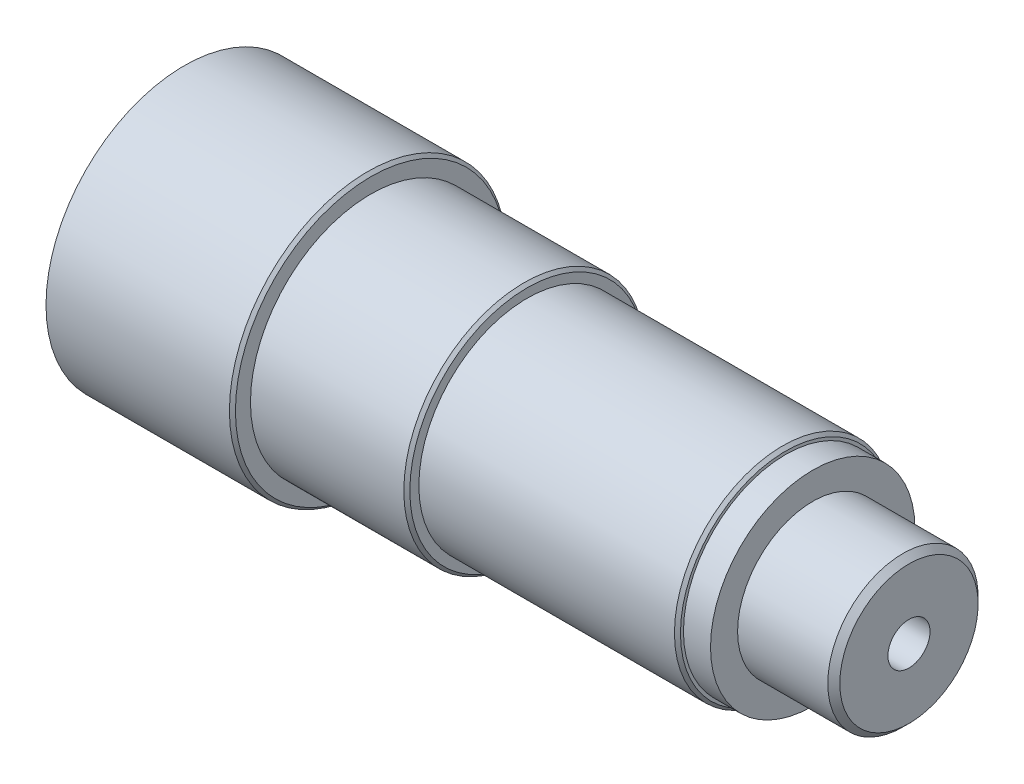
ISO-10303-21;
HEADER;
FILE_DESCRIPTION(('STEP AP214'),'2;1');
FILE_NAME('part.step','',(''),(''),'','','');
FILE_SCHEMA(('AUTOMOTIVE_DESIGN { 1 0 10303 214 1 1 1 1 }'));
ENDSEC;
DATA;
#1=APPLICATION_CONTEXT('core data for automotive mechanical design processes');
#2=APPLICATION_PROTOCOL_DEFINITION('international standard','automotive_design',2000,#1);
#3=PRODUCT_CONTEXT('',#1,'mechanical');
#4=PRODUCT('Part','Part','',(#3));
#5=PRODUCT_RELATED_PRODUCT_CATEGORY('part','',(#4));
#6=PRODUCT_DEFINITION_FORMATION('','',#4);
#7=PRODUCT_DEFINITION_CONTEXT('part definition',#1,'design');
#8=PRODUCT_DEFINITION('design','',#6,#7);
#9=PRODUCT_DEFINITION_SHAPE('','',#8);
#10=(LENGTH_UNIT() NAMED_UNIT(*) SI_UNIT(.MILLI.,.METRE.));
#11=(NAMED_UNIT(*) PLANE_ANGLE_UNIT() SI_UNIT($,.RADIAN.));
#12=(NAMED_UNIT(*) SI_UNIT($,.STERADIAN.) SOLID_ANGLE_UNIT());
#13=UNCERTAINTY_MEASURE_WITH_UNIT(LENGTH_MEASURE(1.E-05),#10,'distance_accuracy_value','');
#14=(GEOMETRIC_REPRESENTATION_CONTEXT(3) GLOBAL_UNCERTAINTY_ASSIGNED_CONTEXT((#13)) GLOBAL_UNIT_ASSIGNED_CONTEXT((#10,
#11,#12)) REPRESENTATION_CONTEXT('',''));
#15=CARTESIAN_POINT('',(0.,0.,0.));
#16=DIRECTION('',(0.,0.,1.));
#17=DIRECTION('',(1.,0.,0.));
#18=AXIS2_PLACEMENT_3D('',#15,#16,#17);
#19=CARTESIAN_POINT('',(-44.,23.,0.));
#20=DIRECTION('',(1.,0.,0.));
#21=DIRECTION('',(0.,0.,-1.));
#22=AXIS2_PLACEMENT_3D('',#19,#20,#21);
#23=PLANE('',#22);
#24=CARTESIAN_POINT('',(-44.,0.,0.));
#25=DIRECTION('',(-1.,0.,0.));
#26=DIRECTION('',(0.,0.,1.));
#27=AXIS2_PLACEMENT_3D('',#24,#25,#26);
#28=CIRCLE('',#27,23.);
#29=CARTESIAN_POINT('',(-44.,0.,23.));
#30=VERTEX_POINT('',#29);
#31=EDGE_CURVE('E75',#30,#30,#28,.T.);
#32=ORIENTED_EDGE('',*,*,#31,.T.);
#33=EDGE_LOOP('',(#32));
#34=FACE_BOUND('',#33,.T.);
#35=ADVANCED_FACE('F36',(#34),#23,.F.);
#36=CARTESIAN_POINT('',(-47.2109830231324,0.,0.));
#37=DIRECTION('',(-1.,0.,0.));
#38=DIRECTION('',(0.,0.,1.));
#39=AXIS2_PLACEMENT_3D('',#36,#37,#38);
#40=CYLINDRICAL_SURFACE('',#39,23.);
#41=CARTESIAN_POINT('',(-13.5,0.,0.));
#42=DIRECTION('',(-1.,0.,0.));
#43=DIRECTION('',(0.,0.,1.));
#44=AXIS2_PLACEMENT_3D('',#41,#42,#43);
#45=CIRCLE('',#44,23.);
#46=CARTESIAN_POINT('',(-13.5,0.,23.));
#47=VERTEX_POINT('',#46);
#48=EDGE_CURVE('E90',#47,#47,#45,.T.);
#49=ORIENTED_EDGE('',*,*,#48,.T.);
#50=EDGE_LOOP('',(#49));
#51=FACE_BOUND('',#50,.T.);
#52=ORIENTED_EDGE('',*,*,#31,.F.);
#53=EDGE_LOOP('',(#52));
#54=FACE_BOUND('',#53,.T.);
#55=ADVANCED_FACE('F111',(#51,#54),#40,.T.);
#56=CARTESIAN_POINT('',(-13.,23.,0.));
#57=DIRECTION('',(-1.,0.,0.));
#58=DIRECTION('',(0.,0.,1.));
#59=AXIS2_PLACEMENT_3D('',#56,#57,#58);
#60=PLANE('',#59);
#61=CARTESIAN_POINT('',(-13.,0.,0.));
#62=DIRECTION('',(-1.,0.,0.));
#63=DIRECTION('',(0.,0.,1.));
#64=AXIS2_PLACEMENT_3D('',#61,#62,#63);
#65=CIRCLE('',#64,22.5);
#66=CARTESIAN_POINT('',(-13.,0.,22.5));
#67=VERTEX_POINT('',#66);
#68=EDGE_CURVE('E93',#67,#67,#65,.F.);
#69=ORIENTED_EDGE('',*,*,#68,.T.);
#70=EDGE_LOOP('',(#69));
#71=FACE_BOUND('',#70,.T.);
#72=CARTESIAN_POINT('',(-13.,0.,0.));
#73=DIRECTION('',(-1.,0.,0.));
#74=DIRECTION('',(0.,0.,1.));
#75=AXIS2_PLACEMENT_3D('',#72,#73,#74);
#76=CIRCLE('',#75,20.);
#77=CARTESIAN_POINT('',(-13.,0.,20.));
#78=VERTEX_POINT('',#77);
#79=EDGE_CURVE('E72',#78,#78,#76,.T.);
#80=ORIENTED_EDGE('',*,*,#79,.T.);
#81=EDGE_LOOP('',(#80));
#82=FACE_BOUND('',#81,.T.);
#83=ADVANCED_FACE('F117',(#71,#82),#60,.F.);
#84=CARTESIAN_POINT('',(-47.2109830231324,0.,0.));
#85=DIRECTION('',(-1.,0.,0.));
#86=DIRECTION('',(0.,0.,1.));
#87=AXIS2_PLACEMENT_3D('',#84,#85,#86);
#88=CYLINDRICAL_SURFACE('',#87,20.);
#89=CARTESIAN_POINT('',(12.5,0.,0.));
#90=DIRECTION('',(-1.,0.,0.));
#91=DIRECTION('',(0.,0.,1.));
#92=AXIS2_PLACEMENT_3D('',#89,#90,#91);
#93=CIRCLE('',#92,20.);
#94=CARTESIAN_POINT('',(12.5,0.,20.));
#95=VERTEX_POINT('',#94);
#96=EDGE_CURVE('E84',#95,#95,#93,.T.);
#97=ORIENTED_EDGE('',*,*,#96,.T.);
#98=EDGE_LOOP('',(#97));
#99=FACE_BOUND('',#98,.T.);
#100=ORIENTED_EDGE('',*,*,#79,.F.);
#101=EDGE_LOOP('',(#100));
#102=FACE_BOUND('',#101,.T.);
#103=ADVANCED_FACE('F135',(#99,#102),#88,.T.);
#104=CARTESIAN_POINT('',(13.,20.,0.));
#105=DIRECTION('',(-1.,0.,0.));
#106=DIRECTION('',(0.,0.,1.));
#107=AXIS2_PLACEMENT_3D('',#104,#105,#106);
#108=PLANE('',#107);
#109=CARTESIAN_POINT('',(13.,0.,0.));
#110=DIRECTION('',(-1.,0.,0.));
#111=DIRECTION('',(0.,0.,1.));
#112=AXIS2_PLACEMENT_3D('',#109,#110,#111);
#113=CIRCLE('',#112,19.5);
#114=CARTESIAN_POINT('',(13.,0.,19.5));
#115=VERTEX_POINT('',#114);
#116=EDGE_CURVE('E87',#115,#115,#113,.F.);
#117=ORIENTED_EDGE('',*,*,#116,.T.);
#118=EDGE_LOOP('',(#117));
#119=FACE_BOUND('',#118,.T.);
#120=CARTESIAN_POINT('',(13.,0.,0.));
#121=DIRECTION('',(-1.,0.,0.));
#122=DIRECTION('',(0.,0.,1.));
#123=AXIS2_PLACEMENT_3D('',#120,#121,#122);
#124=CIRCLE('',#123,18.);
#125=CARTESIAN_POINT('',(13.,0.,18.));
#126=VERTEX_POINT('',#125);
#127=EDGE_CURVE('E69',#126,#126,#124,.T.);
#128=ORIENTED_EDGE('',*,*,#127,.T.);
#129=EDGE_LOOP('',(#128));
#130=FACE_BOUND('',#129,.T.);
#131=ADVANCED_FACE('F138',(#119,#130),#108,.F.);
#132=CARTESIAN_POINT('',(-47.2109830231324,0.,0.));
#133=DIRECTION('',(-1.,0.,0.));
#134=DIRECTION('',(0.,0.,1.));
#135=AXIS2_PLACEMENT_3D('',#132,#133,#134);
#136=CYLINDRICAL_SURFACE('',#135,18.);
#137=CARTESIAN_POINT('',(55.5,0.,0.));
#138=DIRECTION('',(-1.,0.,0.));
#139=DIRECTION('',(0.,0.,1.));
#140=AXIS2_PLACEMENT_3D('',#137,#138,#139);
#141=CIRCLE('',#140,18.);
#142=CARTESIAN_POINT('',(55.5,0.,18.));
#143=VERTEX_POINT('',#142);
#144=EDGE_CURVE('E78',#143,#143,#141,.T.);
#145=ORIENTED_EDGE('',*,*,#144,.T.);
#146=EDGE_LOOP('',(#145));
#147=FACE_BOUND('',#146,.T.);
#148=ORIENTED_EDGE('',*,*,#127,.F.);
#149=EDGE_LOOP('',(#148));
#150=FACE_BOUND('',#149,.T.);
#151=ADVANCED_FACE('F149',(#147,#150),#136,.T.);
#152=CARTESIAN_POINT('',(56.,18.,0.));
#153=DIRECTION('',(-1.,0.,0.));
#154=DIRECTION('',(0.,0.,1.));
#155=AXIS2_PLACEMENT_3D('',#152,#153,#154);
#156=PLANE('',#155);
#157=CARTESIAN_POINT('',(56.,0.,0.));
#158=DIRECTION('',(-1.,0.,0.));
#159=DIRECTION('',(0.,0.,1.));
#160=AXIS2_PLACEMENT_3D('',#157,#158,#159);
#161=CIRCLE('',#160,17.5);
#162=CARTESIAN_POINT('',(56.,0.,17.5));
#163=VERTEX_POINT('',#162);
#164=EDGE_CURVE('E81',#163,#163,#161,.F.);
#165=ORIENTED_EDGE('',*,*,#164,.T.);
#166=EDGE_LOOP('',(#165));
#167=FACE_BOUND('',#166,.T.);
#168=CARTESIAN_POINT('',(56.,0.,0.));
#169=DIRECTION('',(-1.,0.,0.));
#170=DIRECTION('',(0.,0.,1.));
#171=AXIS2_PLACEMENT_3D('',#168,#169,#170);
#172=CIRCLE('',#171,17.);
#173=CARTESIAN_POINT('',(56.,0.,17.));
#174=VERTEX_POINT('',#173);
#175=EDGE_CURVE('E66',#174,#174,#172,.T.);
#176=ORIENTED_EDGE('',*,*,#175,.T.);
#177=EDGE_LOOP('',(#176));
#178=FACE_BOUND('',#177,.T.);
#179=ADVANCED_FACE('F153',(#167,#178),#156,.F.);
#180=CARTESIAN_POINT('',(-47.2109830231324,0.,0.));
#181=DIRECTION('',(-1.,0.,0.));
#182=DIRECTION('',(0.,0.,1.));
#183=AXIS2_PLACEMENT_3D('',#180,#181,#182);
#184=CYLINDRICAL_SURFACE('',#183,17.);
#185=ORIENTED_EDGE('',*,*,#175,.F.);
#186=EDGE_LOOP('',(#185));
#187=FACE_BOUND('',#186,.T.);
#188=CARTESIAN_POINT('',(60.5,0.,0.));
#189=DIRECTION('',(-1.,0.,0.));
#190=DIRECTION('',(0.,0.,1.));
#191=AXIS2_PLACEMENT_3D('',#188,#189,#190);
#192=CIRCLE('',#191,17.);
#193=CARTESIAN_POINT('',(60.5,0.,17.));
#194=VERTEX_POINT('',#193);
#195=EDGE_CURVE('E59',#194,#194,#192,.T.);
#196=ORIENTED_EDGE('',*,*,#195,.T.);
#197=EDGE_LOOP('',(#196));
#198=FACE_BOUND('',#197,.T.);
#199=ADVANCED_FACE('F157',(#187,#198),#184,.T.);
#200=CARTESIAN_POINT('',(60.5,17.,0.));
#201=DIRECTION('',(-1.,0.,0.));
#202=DIRECTION('',(0.,0.,1.));
#203=AXIS2_PLACEMENT_3D('',#200,#201,#202);
#204=PLANE('',#203);
#205=ORIENTED_EDGE('',*,*,#195,.F.);
#206=EDGE_LOOP('',(#205));
#207=FACE_BOUND('',#206,.T.);
#208=CARTESIAN_POINT('',(60.5,0.,0.));
#209=DIRECTION('',(-1.,0.,0.));
#210=DIRECTION('',(0.,0.,1.));
#211=AXIS2_PLACEMENT_3D('',#208,#209,#210);
#212=CIRCLE('',#211,12.5);
#213=CARTESIAN_POINT('',(60.5,0.,12.5));
#214=VERTEX_POINT('',#213);
#215=EDGE_CURVE('E55',#214,#214,#212,.T.);
#216=ORIENTED_EDGE('',*,*,#215,.T.);
#217=EDGE_LOOP('',(#216));
#218=FACE_BOUND('',#217,.T.);
#219=ADVANCED_FACE('F161',(#207,#218),#204,.F.);
#220=CARTESIAN_POINT('',(-47.2109830231324,0.,0.));
#221=DIRECTION('',(-1.,0.,0.));
#222=DIRECTION('',(0.,0.,1.));
#223=AXIS2_PLACEMENT_3D('',#220,#221,#222);
#224=CYLINDRICAL_SURFACE('',#223,12.5);
#225=CARTESIAN_POINT('',(75.5,0.,0.));
#226=DIRECTION('',(-1.,0.,0.));
#227=DIRECTION('',(0.,0.,1.));
#228=AXIS2_PLACEMENT_3D('',#225,#226,#227);
#229=CIRCLE('',#228,12.5);
#230=CARTESIAN_POINT('',(75.5,0.,12.5));
#231=VERTEX_POINT('',#230);
#232=EDGE_CURVE('E43',#231,#231,#229,.T.);
#233=ORIENTED_EDGE('',*,*,#232,.T.);
#234=EDGE_LOOP('',(#233));
#235=FACE_BOUND('',#234,.T.);
#236=ORIENTED_EDGE('',*,*,#215,.F.);
#237=EDGE_LOOP('',(#236));
#238=FACE_BOUND('',#237,.T.);
#239=ADVANCED_FACE('F98',(#235,#238),#224,.T.);
#240=CARTESIAN_POINT('',(76.5,12.5,0.));
#241=DIRECTION('',(-1.,0.,0.));
#242=DIRECTION('',(0.,0.,1.));
#243=AXIS2_PLACEMENT_3D('',#240,#241,#242);
#244=PLANE('',#243);
#245=CARTESIAN_POINT('',(76.5,0.,0.));
#246=DIRECTION('',(1.,0.,0.));
#247=DIRECTION('',(0.,0.,-1.));
#248=AXIS2_PLACEMENT_3D('',#245,#246,#247);
#249=CIRCLE('',#248,3.49999999999999);
#250=CARTESIAN_POINT('',(76.5,0.,-3.49999999999999));
#251=VERTEX_POINT('',#250);
#252=EDGE_CURVE('E56',#251,#251,#249,.T.);
#253=ORIENTED_EDGE('',*,*,#252,.F.);
#254=EDGE_LOOP('',(#253));
#255=FACE_BOUND('',#254,.T.);
#256=CARTESIAN_POINT('',(76.5,0.,0.));
#257=DIRECTION('',(-1.,0.,0.));
#258=DIRECTION('',(0.,0.,1.));
#259=AXIS2_PLACEMENT_3D('',#256,#257,#258);
#260=CIRCLE('',#259,11.5);
#261=CARTESIAN_POINT('',(76.5,0.,11.5));
#262=VERTEX_POINT('',#261);
#263=EDGE_CURVE('E11',#262,#262,#260,.F.);
#264=ORIENTED_EDGE('',*,*,#263,.T.);
#265=EDGE_LOOP('',(#264));
#266=FACE_BOUND('',#265,.T.);
#267=ADVANCED_FACE('F125',(#255,#266),#244,.F.);
#268=CARTESIAN_POINT('',(55.5,0.,0.));
#269=DIRECTION('',(-1.,0.,0.));
#270=DIRECTION('',(0.,0.,1.));
#271=AXIS2_PLACEMENT_3D('',#268,#269,#270);
#272=CONICAL_SURFACE('',#271,18.,0.785398163397445);
#273=ORIENTED_EDGE('',*,*,#164,.F.);
#274=EDGE_LOOP('',(#273));
#275=FACE_BOUND('',#274,.T.);
#276=ORIENTED_EDGE('',*,*,#144,.F.);
#277=EDGE_LOOP('',(#276));
#278=FACE_BOUND('',#277,.T.);
#279=ADVANCED_FACE('F122',(#275,#278),#272,.T.);
#280=CARTESIAN_POINT('',(12.5,0.,0.));
#281=DIRECTION('',(-1.,0.,0.));
#282=DIRECTION('',(0.,0.,1.));
#283=AXIS2_PLACEMENT_3D('',#280,#281,#282);
#284=CONICAL_SURFACE('',#283,20.,0.785398163397445);
#285=ORIENTED_EDGE('',*,*,#116,.F.);
#286=EDGE_LOOP('',(#285));
#287=FACE_BOUND('',#286,.T.);
#288=ORIENTED_EDGE('',*,*,#96,.F.);
#289=EDGE_LOOP('',(#288));
#290=FACE_BOUND('',#289,.T.);
#291=ADVANCED_FACE('F107',(#287,#290),#284,.T.);
#292=CARTESIAN_POINT('',(-13.5,0.,0.));
#293=DIRECTION('',(-1.,0.,0.));
#294=DIRECTION('',(0.,0.,1.));
#295=AXIS2_PLACEMENT_3D('',#292,#293,#294);
#296=CONICAL_SURFACE('',#295,23.,0.785398163397455);
#297=ORIENTED_EDGE('',*,*,#68,.F.);
#298=EDGE_LOOP('',(#297));
#299=FACE_BOUND('',#298,.T.);
#300=ORIENTED_EDGE('',*,*,#48,.F.);
#301=EDGE_LOOP('',(#300));
#302=FACE_BOUND('',#301,.T.);
#303=ADVANCED_FACE('F102',(#299,#302),#296,.T.);
#304=CARTESIAN_POINT('',(75.5,0.,0.));
#305=DIRECTION('',(-1.,0.,0.));
#306=DIRECTION('',(0.,0.,1.));
#307=AXIS2_PLACEMENT_3D('',#304,#305,#306);
#308=CONICAL_SURFACE('',#307,12.5,0.785398163397444);
#309=ORIENTED_EDGE('',*,*,#263,.F.);
#310=EDGE_LOOP('',(#309));
#311=FACE_BOUND('',#310,.T.);
#312=ORIENTED_EDGE('',*,*,#232,.F.);
#313=EDGE_LOOP('',(#312));
#314=FACE_BOUND('',#313,.T.);
#315=ADVANCED_FACE('F38',(#311,#314),#308,.T.);
#316=CARTESIAN_POINT('',(53.5,0.,0.));
#317=DIRECTION('',(1.,0.,0.));
#318=DIRECTION('',(0.,0.,-1.));
#319=AXIS2_PLACEMENT_3D('',#316,#317,#318);
#320=CONICAL_SURFACE('',#319,3.49999999999999,1.02974425867665);
#321=CARTESIAN_POINT('',(51.3969878334035,0.,0.));
#322=VERTEX_POINT('',#321);
#323=VERTEX_LOOP('',#322);
#324=FACE_BOUND('',#323,.T.);
#325=CARTESIAN_POINT('',(53.5,0.,0.));
#326=DIRECTION('',(1.,0.,0.));
#327=DIRECTION('',(0.,0.,-1.));
#328=AXIS2_PLACEMENT_3D('',#325,#326,#327);
#329=CIRCLE('',#328,3.49999999999999);
#330=CARTESIAN_POINT('',(53.5,0.,-3.49999999999999));
#331=VERTEX_POINT('',#330);
#332=EDGE_CURVE('E53',#331,#331,#329,.T.);
#333=ORIENTED_EDGE('',*,*,#332,.T.);
#334=EDGE_LOOP('',(#333));
#335=FACE_BOUND('',#334,.T.);
#336=ADVANCED_FACE('F46',(#324,#335),#320,.F.);
#337=CARTESIAN_POINT('',(76.5,0.,0.));
#338=DIRECTION('',(1.,0.,0.));
#339=DIRECTION('',(0.,0.,-1.));
#340=AXIS2_PLACEMENT_3D('',#337,#338,#339);
#341=CYLINDRICAL_SURFACE('',#340,3.49999999999999);
#342=ORIENTED_EDGE('',*,*,#332,.F.);
#343=EDGE_LOOP('',(#342));
#344=FACE_BOUND('',#343,.T.);
#345=ORIENTED_EDGE('',*,*,#252,.T.);
#346=EDGE_LOOP('',(#345));
#347=FACE_BOUND('',#346,.T.);
#348=ADVANCED_FACE('F49',(#344,#347),#341,.F.);
#349=CLOSED_SHELL('',(#35,#55,#83,#103,#131,#151,#179,#199,#219,#239,#267,#279,#291,#303,#315,
#336,#348));
#350=MANIFOLD_SOLID_BREP('B2',#349);
#351=ADVANCED_BREP_SHAPE_REPRESENTATION('',(#18,#350),#14);
#352=SHAPE_DEFINITION_REPRESENTATION(#9,#351);
ENDSEC;
END-ISO-10303-21;
